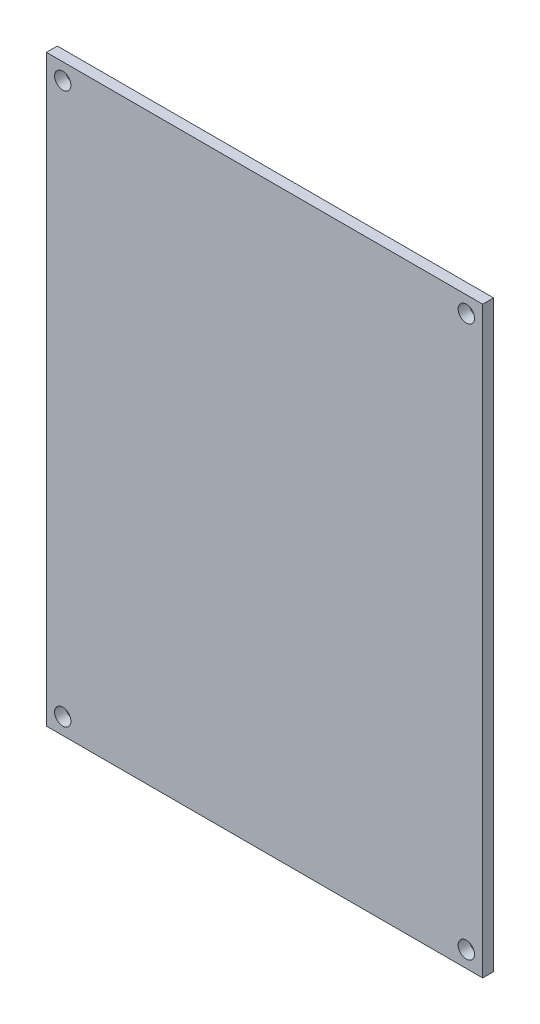
ISO-10303-21;
HEADER;
FILE_DESCRIPTION(('STEP AP214'),'2;1');
FILE_NAME('part.step','',(''),(''),'','','');
FILE_SCHEMA(('AUTOMOTIVE_DESIGN { 1 0 10303 214 1 1 1 1 }'));
ENDSEC;
DATA;
#1=APPLICATION_CONTEXT('core data for automotive mechanical design processes');
#2=APPLICATION_PROTOCOL_DEFINITION('international standard','automotive_design',2000,#1);
#3=PRODUCT_CONTEXT('',#1,'mechanical');
#4=PRODUCT('Part','Part','',(#3));
#5=PRODUCT_RELATED_PRODUCT_CATEGORY('part','',(#4));
#6=PRODUCT_DEFINITION_FORMATION('','',#4);
#7=PRODUCT_DEFINITION_CONTEXT('part definition',#1,'design');
#8=PRODUCT_DEFINITION('design','',#6,#7);
#9=PRODUCT_DEFINITION_SHAPE('','',#8);
#10=(LENGTH_UNIT() NAMED_UNIT(*) SI_UNIT(.MILLI.,.METRE.));
#11=(NAMED_UNIT(*) PLANE_ANGLE_UNIT() SI_UNIT($,.RADIAN.));
#12=(NAMED_UNIT(*) SI_UNIT($,.STERADIAN.) SOLID_ANGLE_UNIT());
#13=UNCERTAINTY_MEASURE_WITH_UNIT(LENGTH_MEASURE(1.E-05),#10,'distance_accuracy_value','');
#14=(GEOMETRIC_REPRESENTATION_CONTEXT(3) GLOBAL_UNCERTAINTY_ASSIGNED_CONTEXT((#13)) GLOBAL_UNIT_ASSIGNED_CONTEXT((#10,
#11,#12)) REPRESENTATION_CONTEXT('',''));
#15=CARTESIAN_POINT('',(0.,0.,0.));
#16=DIRECTION('',(0.,0.,1.));
#17=DIRECTION('',(1.,0.,0.));
#18=AXIS2_PLACEMENT_3D('',#15,#16,#17);
#19=CARTESIAN_POINT('',(0.,0.,2.));
#20=DIRECTION('',(0.,0.,-1.));
#21=DIRECTION('',(-1.,0.,0.));
#22=AXIS2_PLACEMENT_3D('',#19,#20,#21);
#23=PLANE('',#22);
#24=DIRECTION('',(0.,-1.,0.));
#25=VECTOR('',#24,1.);
#26=CARTESIAN_POINT('',(0.,0.,2.));
#27=LINE('',#26,#25);
#28=CARTESIAN_POINT('',(0.,107.,2.));
#29=VERTEX_POINT('',#28);
#30=CARTESIAN_POINT('',(0.,0.,2.));
#31=VERTEX_POINT('',#30);
#32=EDGE_CURVE('E92',#29,#31,#27,.T.);
#33=ORIENTED_EDGE('',*,*,#32,.T.);
#34=DIRECTION('',(1.,0.,0.));
#35=VECTOR('',#34,1.);
#36=CARTESIAN_POINT('',(0.,0.,2.));
#37=LINE('',#36,#35);
#38=CARTESIAN_POINT('',(80.,0.,2.));
#39=VERTEX_POINT('',#38);
#40=EDGE_CURVE('E87',#31,#39,#37,.T.);
#41=ORIENTED_EDGE('',*,*,#40,.T.);
#42=DIRECTION('',(0.,1.,0.));
#43=VECTOR('',#42,1.);
#44=CARTESIAN_POINT('',(80.,0.,2.));
#45=LINE('',#44,#43);
#46=CARTESIAN_POINT('',(80.,107.,2.));
#47=VERTEX_POINT('',#46);
#48=EDGE_CURVE('E90',#39,#47,#45,.T.);
#49=ORIENTED_EDGE('',*,*,#48,.T.);
#50=DIRECTION('',(-1.,0.,0.));
#51=VECTOR('',#50,1.);
#52=CARTESIAN_POINT('',(0.,107.,2.));
#53=LINE('',#52,#51);
#54=EDGE_CURVE('E57',#47,#29,#53,.T.);
#55=ORIENTED_EDGE('',*,*,#54,.T.);
#56=EDGE_LOOP('',(#33,#41,#49,#55));
#57=FACE_BOUND('',#56,.T.);
#58=CARTESIAN_POINT('',(3.,3.,2.));
#59=DIRECTION('',(0.,0.,1.));
#60=DIRECTION('',(1.,0.,0.));
#61=AXIS2_PLACEMENT_3D('',#58,#59,#60);
#62=CIRCLE('',#61,1.5);
#63=CARTESIAN_POINT('',(4.5,3.,2.));
#64=VERTEX_POINT('',#63);
#65=EDGE_CURVE('E112',#64,#64,#62,.T.);
#66=ORIENTED_EDGE('',*,*,#65,.F.);
#67=EDGE_LOOP('',(#66));
#68=FACE_BOUND('',#67,.T.);
#69=CARTESIAN_POINT('',(77.,3.,2.));
#70=DIRECTION('',(0.,0.,1.));
#71=DIRECTION('',(1.,0.,0.));
#72=AXIS2_PLACEMENT_3D('',#69,#70,#71);
#73=CIRCLE('',#72,1.5);
#74=CARTESIAN_POINT('',(78.5,3.,2.));
#75=VERTEX_POINT('',#74);
#76=EDGE_CURVE('E134',#75,#75,#73,.T.);
#77=ORIENTED_EDGE('',*,*,#76,.F.);
#78=EDGE_LOOP('',(#77));
#79=FACE_BOUND('',#78,.T.);
#80=CARTESIAN_POINT('',(77.,104.,2.));
#81=DIRECTION('',(0.,0.,1.));
#82=DIRECTION('',(1.,0.,0.));
#83=AXIS2_PLACEMENT_3D('',#80,#81,#82);
#84=CIRCLE('',#83,1.5);
#85=CARTESIAN_POINT('',(78.5,104.,2.));
#86=VERTEX_POINT('',#85);
#87=EDGE_CURVE('E142',#86,#86,#84,.T.);
#88=ORIENTED_EDGE('',*,*,#87,.F.);
#89=EDGE_LOOP('',(#88));
#90=FACE_BOUND('',#89,.T.);
#91=CARTESIAN_POINT('',(3.,104.,2.));
#92=DIRECTION('',(0.,0.,1.));
#93=DIRECTION('',(1.,0.,0.));
#94=AXIS2_PLACEMENT_3D('',#91,#92,#93);
#95=CIRCLE('',#94,1.5);
#96=CARTESIAN_POINT('',(4.5,104.,2.));
#97=VERTEX_POINT('',#96);
#98=EDGE_CURVE('E150',#97,#97,#95,.T.);
#99=ORIENTED_EDGE('',*,*,#98,.F.);
#100=EDGE_LOOP('',(#99));
#101=FACE_BOUND('',#100,.T.);
#102=ADVANCED_FACE('F39',(#57,#68,#79,#90,#101),#23,.F.);
#103=CARTESIAN_POINT('',(0.,0.,0.));
#104=DIRECTION('',(0.,0.,-1.));
#105=DIRECTION('',(-1.,0.,0.));
#106=AXIS2_PLACEMENT_3D('',#103,#104,#105);
#107=PLANE('',#106);
#108=CARTESIAN_POINT('',(77.,104.,0.));
#109=DIRECTION('',(0.,0.,1.));
#110=DIRECTION('',(1.,0.,0.));
#111=AXIS2_PLACEMENT_3D('',#108,#109,#110);
#112=CIRCLE('',#111,1.5);
#113=CARTESIAN_POINT('',(78.5,104.,0.));
#114=VERTEX_POINT('',#113);
#115=EDGE_CURVE('E146',#114,#114,#112,.T.);
#116=ORIENTED_EDGE('',*,*,#115,.T.);
#117=EDGE_LOOP('',(#116));
#118=FACE_BOUND('',#117,.T.);
#119=CARTESIAN_POINT('',(3.,3.,0.));
#120=DIRECTION('',(0.,0.,1.));
#121=DIRECTION('',(1.,0.,0.));
#122=AXIS2_PLACEMENT_3D('',#119,#120,#121);
#123=CIRCLE('',#122,1.5);
#124=CARTESIAN_POINT('',(4.5,3.,0.));
#125=VERTEX_POINT('',#124);
#126=EDGE_CURVE('E130',#125,#125,#123,.T.);
#127=ORIENTED_EDGE('',*,*,#126,.T.);
#128=EDGE_LOOP('',(#127));
#129=FACE_BOUND('',#128,.T.);
#130=DIRECTION('',(0.,-1.,0.));
#131=VECTOR('',#130,1.);
#132=CARTESIAN_POINT('',(0.,0.,0.));
#133=LINE('',#132,#131);
#134=CARTESIAN_POINT('',(0.,107.,0.));
#135=VERTEX_POINT('',#134);
#136=CARTESIAN_POINT('',(0.,0.,0.));
#137=VERTEX_POINT('',#136);
#138=EDGE_CURVE('E108',#135,#137,#133,.T.);
#139=ORIENTED_EDGE('',*,*,#138,.F.);
#140=DIRECTION('',(-1.,0.,0.));
#141=VECTOR('',#140,1.);
#142=CARTESIAN_POINT('',(0.,107.,0.));
#143=LINE('',#142,#141);
#144=CARTESIAN_POINT('',(80.,107.,0.));
#145=VERTEX_POINT('',#144);
#146=EDGE_CURVE('E80',#145,#135,#143,.T.);
#147=ORIENTED_EDGE('',*,*,#146,.F.);
#148=DIRECTION('',(0.,1.,0.));
#149=VECTOR('',#148,1.);
#150=CARTESIAN_POINT('',(80.,0.,0.));
#151=LINE('',#150,#149);
#152=CARTESIAN_POINT('',(80.,0.,0.));
#153=VERTEX_POINT('',#152);
#154=EDGE_CURVE('E74',#153,#145,#151,.T.);
#155=ORIENTED_EDGE('',*,*,#154,.F.);
#156=DIRECTION('',(1.,0.,0.));
#157=VECTOR('',#156,1.);
#158=CARTESIAN_POINT('',(0.,0.,0.));
#159=LINE('',#158,#157);
#160=EDGE_CURVE('E97',#137,#153,#159,.T.);
#161=ORIENTED_EDGE('',*,*,#160,.F.);
#162=EDGE_LOOP('',(#139,#147,#155,#161));
#163=FACE_BOUND('',#162,.T.);
#164=CARTESIAN_POINT('',(77.,3.,0.));
#165=DIRECTION('',(0.,0.,1.));
#166=DIRECTION('',(1.,0.,0.));
#167=AXIS2_PLACEMENT_3D('',#164,#165,#166);
#168=CIRCLE('',#167,1.5);
#169=CARTESIAN_POINT('',(78.5,3.,0.));
#170=VERTEX_POINT('',#169);
#171=EDGE_CURVE('E138',#170,#170,#168,.T.);
#172=ORIENTED_EDGE('',*,*,#171,.T.);
#173=EDGE_LOOP('',(#172));
#174=FACE_BOUND('',#173,.T.);
#175=CARTESIAN_POINT('',(3.,104.,0.));
#176=DIRECTION('',(0.,0.,1.));
#177=DIRECTION('',(1.,0.,0.));
#178=AXIS2_PLACEMENT_3D('',#175,#176,#177);
#179=CIRCLE('',#178,1.5);
#180=CARTESIAN_POINT('',(4.5,104.,0.));
#181=VERTEX_POINT('',#180);
#182=EDGE_CURVE('E154',#181,#181,#179,.T.);
#183=ORIENTED_EDGE('',*,*,#182,.T.);
#184=EDGE_LOOP('',(#183));
#185=FACE_BOUND('',#184,.T.);
#186=ADVANCED_FACE('F125',(#118,#129,#163,#174,#185),#107,.T.);
#187=CARTESIAN_POINT('',(0.,0.,2.));
#188=DIRECTION('',(1.,0.,0.));
#189=DIRECTION('',(0.,0.,-1.));
#190=AXIS2_PLACEMENT_3D('',#187,#188,#189);
#191=PLANE('',#190);
#192=ORIENTED_EDGE('',*,*,#138,.T.);
#193=DIRECTION('',(0.,0.,-1.));
#194=VECTOR('',#193,1.);
#195=CARTESIAN_POINT('',(0.,0.,2.));
#196=LINE('',#195,#194);
#197=EDGE_CURVE('E11',#31,#137,#196,.T.);
#198=ORIENTED_EDGE('',*,*,#197,.F.);
#199=ORIENTED_EDGE('',*,*,#32,.F.);
#200=DIRECTION('',(0.,0.,-1.));
#201=VECTOR('',#200,1.);
#202=CARTESIAN_POINT('',(0.,107.,2.));
#203=LINE('',#202,#201);
#204=EDGE_CURVE('E104',#29,#135,#203,.T.);
#205=ORIENTED_EDGE('',*,*,#204,.T.);
#206=EDGE_LOOP('',(#192,#198,#199,#205));
#207=FACE_BOUND('',#206,.T.);
#208=ADVANCED_FACE('F41',(#207),#191,.F.);
#209=CARTESIAN_POINT('',(0.,0.,2.));
#210=DIRECTION('',(0.,1.,0.));
#211=DIRECTION('',(0.,0.,1.));
#212=AXIS2_PLACEMENT_3D('',#209,#210,#211);
#213=PLANE('',#212);
#214=ORIENTED_EDGE('',*,*,#160,.T.);
#215=DIRECTION('',(0.,0.,-1.));
#216=VECTOR('',#215,1.);
#217=CARTESIAN_POINT('',(80.,0.,2.));
#218=LINE('',#217,#216);
#219=EDGE_CURVE('E49',#39,#153,#218,.T.);
#220=ORIENTED_EDGE('',*,*,#219,.F.);
#221=ORIENTED_EDGE('',*,*,#40,.F.);
#222=ORIENTED_EDGE('',*,*,#197,.T.);
#223=EDGE_LOOP('',(#214,#220,#221,#222));
#224=FACE_BOUND('',#223,.T.);
#225=ADVANCED_FACE('F96',(#224),#213,.F.);
#226=CARTESIAN_POINT('',(80.,0.,2.));
#227=DIRECTION('',(-1.,0.,0.));
#228=DIRECTION('',(0.,0.,1.));
#229=AXIS2_PLACEMENT_3D('',#226,#227,#228);
#230=PLANE('',#229);
#231=ORIENTED_EDGE('',*,*,#154,.T.);
#232=DIRECTION('',(0.,0.,-1.));
#233=VECTOR('',#232,1.);
#234=CARTESIAN_POINT('',(80.,107.,2.));
#235=LINE('',#234,#233);
#236=EDGE_CURVE('E99',#47,#145,#235,.T.);
#237=ORIENTED_EDGE('',*,*,#236,.F.);
#238=ORIENTED_EDGE('',*,*,#48,.F.);
#239=ORIENTED_EDGE('',*,*,#219,.T.);
#240=EDGE_LOOP('',(#231,#237,#238,#239));
#241=FACE_BOUND('',#240,.T.);
#242=ADVANCED_FACE('F100',(#241),#230,.F.);
#243=CARTESIAN_POINT('',(0.,107.,2.));
#244=DIRECTION('',(0.,-1.,0.));
#245=DIRECTION('',(0.,0.,-1.));
#246=AXIS2_PLACEMENT_3D('',#243,#244,#245);
#247=PLANE('',#246);
#248=ORIENTED_EDGE('',*,*,#146,.T.);
#249=ORIENTED_EDGE('',*,*,#204,.F.);
#250=ORIENTED_EDGE('',*,*,#54,.F.);
#251=ORIENTED_EDGE('',*,*,#236,.T.);
#252=EDGE_LOOP('',(#248,#249,#250,#251));
#253=FACE_BOUND('',#252,.T.);
#254=ADVANCED_FACE('F122',(#253),#247,.F.);
#255=CARTESIAN_POINT('',(3.,3.,2.));
#256=DIRECTION('',(0.,0.,-1.));
#257=DIRECTION('',(-1.,0.,0.));
#258=AXIS2_PLACEMENT_3D('',#255,#256,#257);
#259=CYLINDRICAL_SURFACE('',#258,1.5);
#260=ORIENTED_EDGE('',*,*,#65,.T.);
#261=EDGE_LOOP('',(#260));
#262=FACE_BOUND('',#261,.T.);
#263=ORIENTED_EDGE('',*,*,#126,.F.);
#264=EDGE_LOOP('',(#263));
#265=FACE_BOUND('',#264,.T.);
#266=ADVANCED_FACE('F173',(#262,#265),#259,.F.);
#267=CARTESIAN_POINT('',(77.,3.,2.));
#268=DIRECTION('',(0.,0.,-1.));
#269=DIRECTION('',(-1.,0.,0.));
#270=AXIS2_PLACEMENT_3D('',#267,#268,#269);
#271=CYLINDRICAL_SURFACE('',#270,1.5);
#272=ORIENTED_EDGE('',*,*,#76,.T.);
#273=EDGE_LOOP('',(#272));
#274=FACE_BOUND('',#273,.T.);
#275=ORIENTED_EDGE('',*,*,#171,.F.);
#276=EDGE_LOOP('',(#275));
#277=FACE_BOUND('',#276,.T.);
#278=ADVANCED_FACE('F219',(#274,#277),#271,.F.);
#279=CARTESIAN_POINT('',(77.,104.,2.));
#280=DIRECTION('',(0.,0.,-1.));
#281=DIRECTION('',(-1.,0.,0.));
#282=AXIS2_PLACEMENT_3D('',#279,#280,#281);
#283=CYLINDRICAL_SURFACE('',#282,1.5);
#284=ORIENTED_EDGE('',*,*,#87,.T.);
#285=EDGE_LOOP('',(#284));
#286=FACE_BOUND('',#285,.T.);
#287=ORIENTED_EDGE('',*,*,#115,.F.);
#288=EDGE_LOOP('',(#287));
#289=FACE_BOUND('',#288,.T.);
#290=ADVANCED_FACE('F227',(#286,#289),#283,.F.);
#291=CARTESIAN_POINT('',(3.,104.,2.));
#292=DIRECTION('',(0.,0.,-1.));
#293=DIRECTION('',(-1.,0.,0.));
#294=AXIS2_PLACEMENT_3D('',#291,#292,#293);
#295=CYLINDRICAL_SURFACE('',#294,1.5);
#296=ORIENTED_EDGE('',*,*,#98,.T.);
#297=EDGE_LOOP('',(#296));
#298=FACE_BOUND('',#297,.T.);
#299=ORIENTED_EDGE('',*,*,#182,.F.);
#300=EDGE_LOOP('',(#299));
#301=FACE_BOUND('',#300,.T.);
#302=ADVANCED_FACE('F162',(#298,#301),#295,.F.);
#303=CLOSED_SHELL('',(#102,#186,#208,#225,#242,#254,#266,#278,#290,#302));
#304=MANIFOLD_SOLID_BREP('B2',#303);
#305=ADVANCED_BREP_SHAPE_REPRESENTATION('',(#18,#304),#14);
#306=SHAPE_DEFINITION_REPRESENTATION(#9,#305);
ENDSEC;
END-ISO-10303-21;
